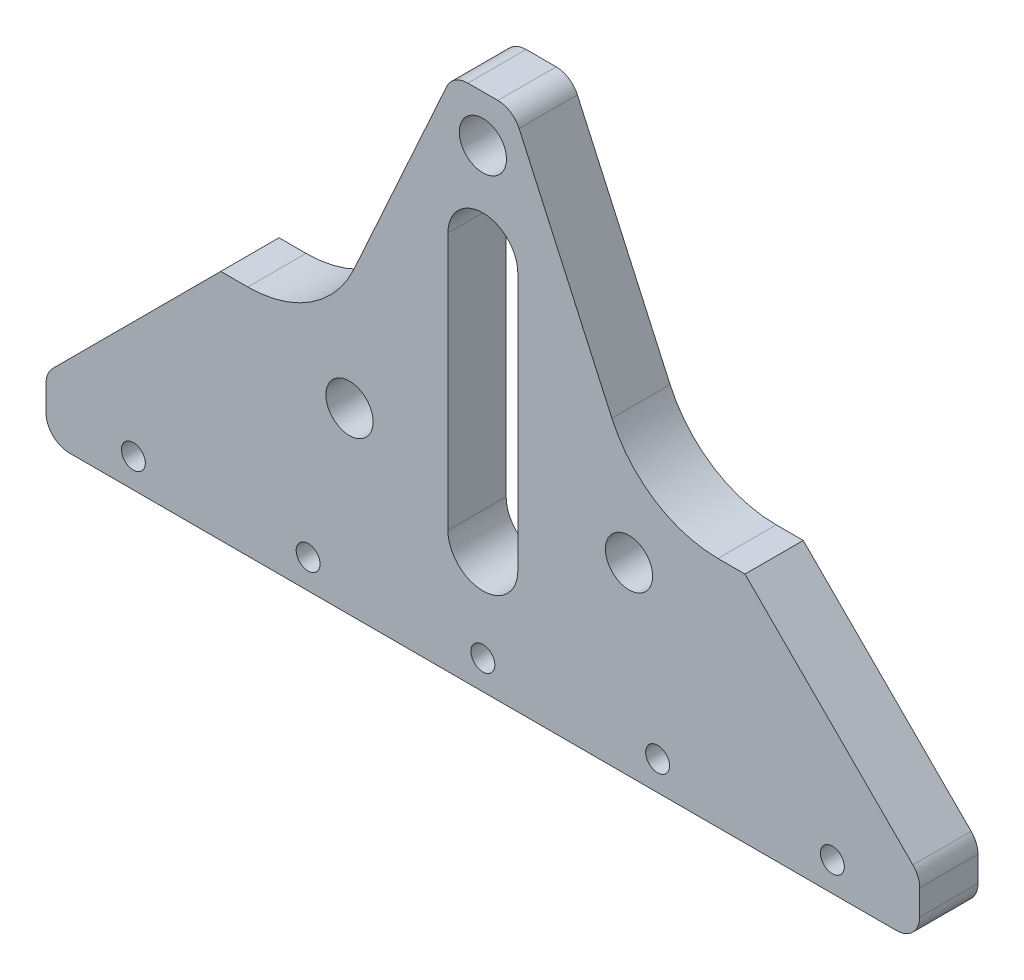
ISO-10303-21;
HEADER;
FILE_DESCRIPTION(('STEP AP214'),'2;1');
FILE_NAME('part.step','',(''),(''),'','','');
FILE_SCHEMA(('AUTOMOTIVE_DESIGN { 1 0 10303 214 1 1 1 1 }'));
ENDSEC;
DATA;
#1=APPLICATION_CONTEXT('core data for automotive mechanical design processes');
#2=APPLICATION_PROTOCOL_DEFINITION('international standard','automotive_design',2000,#1);
#3=PRODUCT_CONTEXT('',#1,'mechanical');
#4=PRODUCT('Part','Part','',(#3));
#5=PRODUCT_RELATED_PRODUCT_CATEGORY('part','',(#4));
#6=PRODUCT_DEFINITION_FORMATION('','',#4);
#7=PRODUCT_DEFINITION_CONTEXT('part definition',#1,'design');
#8=PRODUCT_DEFINITION('design','',#6,#7);
#9=PRODUCT_DEFINITION_SHAPE('','',#8);
#10=(LENGTH_UNIT() NAMED_UNIT(*) SI_UNIT(.MILLI.,.METRE.));
#11=(NAMED_UNIT(*) PLANE_ANGLE_UNIT() SI_UNIT($,.RADIAN.));
#12=(NAMED_UNIT(*) SI_UNIT($,.STERADIAN.) SOLID_ANGLE_UNIT());
#13=UNCERTAINTY_MEASURE_WITH_UNIT(LENGTH_MEASURE(1.E-05),#10,'distance_accuracy_value','');
#14=(GEOMETRIC_REPRESENTATION_CONTEXT(3) GLOBAL_UNCERTAINTY_ASSIGNED_CONTEXT((#13)) GLOBAL_UNIT_ASSIGNED_CONTEXT((#10,
#11,#12)) REPRESENTATION_CONTEXT('',''));
#15=CARTESIAN_POINT('',(0.,0.,0.));
#16=DIRECTION('',(0.,0.,1.));
#17=DIRECTION('',(1.,0.,0.));
#18=AXIS2_PLACEMENT_3D('',#15,#16,#17);
#19=CARTESIAN_POINT('',(37.5,-28.,5.));
#20=DIRECTION('',(-1.,0.,0.));
#21=DIRECTION('',(0.,0.,1.));
#22=AXIS2_PLACEMENT_3D('',#19,#20,#21);
#23=PLANE('',#22);
#24=DIRECTION('',(0.,1.,0.));
#25=VECTOR('',#24,1.);
#26=CARTESIAN_POINT('',(37.5,-28.,0.));
#27=LINE('',#26,#25);
#28=CARTESIAN_POINT('',(37.5,-26.,0.));
#29=VERTEX_POINT('',#28);
#30=CARTESIAN_POINT('',(37.5,-23.8284271247462,0.));
#31=VERTEX_POINT('',#30);
#32=EDGE_CURVE('E298',#29,#31,#27,.T.);
#33=ORIENTED_EDGE('',*,*,#32,.T.);
#34=DIRECTION('',(0.,0.,-1.));
#35=VECTOR('',#34,1.);
#36=CARTESIAN_POINT('',(37.5,-23.8284271247462,5.));
#37=LINE('',#36,#35);
#38=CARTESIAN_POINT('',(37.5,-23.8284271247462,5.));
#39=VERTEX_POINT('',#38);
#40=EDGE_CURVE('E372',#31,#39,#37,.F.);
#41=ORIENTED_EDGE('',*,*,#40,.T.);
#42=DIRECTION('',(0.,1.,0.));
#43=VECTOR('',#42,1.);
#44=CARTESIAN_POINT('',(37.5,-28.,5.));
#45=LINE('',#44,#43);
#46=CARTESIAN_POINT('',(37.5,-26.,5.));
#47=VERTEX_POINT('',#46);
#48=EDGE_CURVE('E313',#47,#39,#45,.T.);
#49=ORIENTED_EDGE('',*,*,#48,.F.);
#50=DIRECTION('',(0.,0.,-1.));
#51=VECTOR('',#50,1.);
#52=CARTESIAN_POINT('',(37.5,-26.,5.));
#53=LINE('',#52,#51);
#54=EDGE_CURVE('E369',#47,#29,#53,.T.);
#55=ORIENTED_EDGE('',*,*,#54,.T.);
#56=EDGE_LOOP('',(#33,#41,#49,#55));
#57=FACE_BOUND('',#56,.T.);
#58=ADVANCED_FACE('F35',(#57),#23,.F.);
#59=CARTESIAN_POINT('',(-37.5,-28.,5.));
#60=DIRECTION('',(1.,0.,0.));
#61=DIRECTION('',(0.,0.,-1.));
#62=AXIS2_PLACEMENT_3D('',#59,#60,#61);
#63=PLANE('',#62);
#64=DIRECTION('',(0.,-1.,0.));
#65=VECTOR('',#64,1.);
#66=CARTESIAN_POINT('',(-37.5,-28.,0.));
#67=LINE('',#66,#65);
#68=CARTESIAN_POINT('',(-37.5,-23.8284271247463,0.));
#69=VERTEX_POINT('',#68);
#70=CARTESIAN_POINT('',(-37.5,-26.,0.));
#71=VERTEX_POINT('',#70);
#72=EDGE_CURVE('E326',#69,#71,#67,.T.);
#73=ORIENTED_EDGE('',*,*,#72,.T.);
#74=DIRECTION('',(0.,0.,-1.));
#75=VECTOR('',#74,1.);
#76=CARTESIAN_POINT('',(-37.5,-26.,5.));
#77=LINE('',#76,#75);
#78=CARTESIAN_POINT('',(-37.5,-26.,5.));
#79=VERTEX_POINT('',#78);
#80=EDGE_CURVE('E390',#71,#79,#77,.F.);
#81=ORIENTED_EDGE('',*,*,#80,.T.);
#82=DIRECTION('',(0.,-1.,0.));
#83=VECTOR('',#82,1.);
#84=CARTESIAN_POINT('',(-37.5,-28.,5.));
#85=LINE('',#84,#83);
#86=CARTESIAN_POINT('',(-37.5,-23.8284271247463,5.));
#87=VERTEX_POINT('',#86);
#88=EDGE_CURVE('E316',#87,#79,#85,.T.);
#89=ORIENTED_EDGE('',*,*,#88,.F.);
#90=DIRECTION('',(0.,0.,-1.));
#91=VECTOR('',#90,1.);
#92=CARTESIAN_POINT('',(-37.5,-23.8284271247463,5.));
#93=LINE('',#92,#91);
#94=EDGE_CURVE('E387',#87,#69,#93,.T.);
#95=ORIENTED_EDGE('',*,*,#94,.T.);
#96=EDGE_LOOP('',(#73,#81,#89,#95));
#97=FACE_BOUND('',#96,.T.);
#98=ADVANCED_FACE('F456',(#97),#63,.F.);
#99=CARTESIAN_POINT('',(-37.5,-28.,5.));
#100=DIRECTION('',(0.,1.,0.));
#101=DIRECTION('',(0.,0.,1.));
#102=AXIS2_PLACEMENT_3D('',#99,#100,#101);
#103=PLANE('',#102);
#104=DIRECTION('',(1.,0.,0.));
#105=VECTOR('',#104,1.);
#106=CARTESIAN_POINT('',(-37.5,-28.,0.));
#107=LINE('',#106,#105);
#108=CARTESIAN_POINT('',(-35.5,-28.,0.));
#109=VERTEX_POINT('',#108);
#110=CARTESIAN_POINT('',(35.5,-28.,0.));
#111=VERTEX_POINT('',#110);
#112=EDGE_CURVE('E317',#109,#111,#107,.T.);
#113=ORIENTED_EDGE('',*,*,#112,.T.);
#114=DIRECTION('',(0.,0.,-1.));
#115=VECTOR('',#114,1.);
#116=CARTESIAN_POINT('',(35.5,-28.,5.));
#117=LINE('',#116,#115);
#118=CARTESIAN_POINT('',(35.5,-28.,5.));
#119=VERTEX_POINT('',#118);
#120=EDGE_CURVE('E385',#111,#119,#117,.F.);
#121=ORIENTED_EDGE('',*,*,#120,.T.);
#122=DIRECTION('',(1.,0.,0.));
#123=VECTOR('',#122,1.);
#124=CARTESIAN_POINT('',(-37.5,-28.,5.));
#125=LINE('',#124,#123);
#126=CARTESIAN_POINT('',(-35.5,-28.,5.));
#127=VERTEX_POINT('',#126);
#128=EDGE_CURVE('E320',#127,#119,#125,.T.);
#129=ORIENTED_EDGE('',*,*,#128,.F.);
#130=DIRECTION('',(0.,0.,-1.));
#131=VECTOR('',#130,1.);
#132=CARTESIAN_POINT('',(-35.5,-28.,5.));
#133=LINE('',#132,#131);
#134=EDGE_CURVE('E382',#127,#109,#133,.T.);
#135=ORIENTED_EDGE('',*,*,#134,.T.);
#136=EDGE_LOOP('',(#113,#121,#129,#135));
#137=FACE_BOUND('',#136,.T.);
#138=ADVANCED_FACE('F447',(#137),#103,.F.);
#139=CARTESIAN_POINT('',(0.,0.,5.));
#140=DIRECTION('',(0.,0.,-1.));
#141=DIRECTION('',(-1.,0.,0.));
#142=AXIS2_PLACEMENT_3D('',#139,#140,#141);
#143=PLANE('',#142);
#144=DIRECTION('',(0.,-1.,0.));
#145=VECTOR('',#144,1.);
#146=CARTESIAN_POINT('',(3.,0.,5.));
#147=LINE('',#146,#145);
#148=CARTESIAN_POINT('',(3.,4.60340392159669,5.));
#149=VERTEX_POINT('',#148);
#150=CARTESIAN_POINT('',(3.,-17.5000000000002,5.));
#151=VERTEX_POINT('',#150);
#152=EDGE_CURVE('E225',#149,#151,#147,.T.);
#153=ORIENTED_EDGE('',*,*,#152,.T.);
#154=CARTESIAN_POINT('',(0.,-17.5000000000002,5.));
#155=DIRECTION('',(0.,0.,-1.));
#156=DIRECTION('',(-1.,0.,0.));
#157=AXIS2_PLACEMENT_3D('',#154,#155,#156);
#158=CIRCLE('',#157,3.);
#159=CARTESIAN_POINT('',(-3.,-17.5000000000002,5.));
#160=VERTEX_POINT('',#159);
#161=EDGE_CURVE('E228',#151,#160,#158,.T.);
#162=ORIENTED_EDGE('',*,*,#161,.T.);
#163=DIRECTION('',(0.,1.,0.));
#164=VECTOR('',#163,1.);
#165=CARTESIAN_POINT('',(-3.,0.,5.));
#166=LINE('',#165,#164);
#167=CARTESIAN_POINT('',(-3.,4.60340392159669,5.));
#168=VERTEX_POINT('',#167);
#169=EDGE_CURVE('E220',#160,#168,#166,.T.);
#170=ORIENTED_EDGE('',*,*,#169,.T.);
#171=CARTESIAN_POINT('',(0.,4.60340392159669,5.));
#172=DIRECTION('',(0.,0.,-1.));
#173=DIRECTION('',(-1.,0.,0.));
#174=AXIS2_PLACEMENT_3D('',#171,#172,#173);
#175=CIRCLE('',#174,3.);
#176=EDGE_CURVE('E195',#168,#149,#175,.T.);
#177=ORIENTED_EDGE('',*,*,#176,.T.);
#178=EDGE_LOOP('',(#153,#162,#170,#177));
#179=FACE_BOUND('',#178,.T.);
#180=CARTESIAN_POINT('',(-30.,-25.5,5.));
#181=DIRECTION('',(0.,0.,-1.));
#182=DIRECTION('',(-1.,0.,0.));
#183=AXIS2_PLACEMENT_3D('',#180,#181,#182);
#184=CIRCLE('',#183,1.02499999999989);
#185=CARTESIAN_POINT('',(-31.0249999999999,-25.5,5.));
#186=VERTEX_POINT('',#185);
#187=EDGE_CURVE('E268',#186,#186,#184,.T.);
#188=ORIENTED_EDGE('',*,*,#187,.T.);
#189=EDGE_LOOP('',(#188));
#190=FACE_BOUND('',#189,.T.);
#191=CARTESIAN_POINT('',(-15.,-25.5000000000001,5.));
#192=DIRECTION('',(0.,0.,-1.));
#193=DIRECTION('',(-1.,0.,0.));
#194=AXIS2_PLACEMENT_3D('',#191,#192,#193);
#195=CIRCLE('',#194,1.025);
#196=CARTESIAN_POINT('',(-16.025,-25.5000000000001,5.));
#197=VERTEX_POINT('',#196);
#198=EDGE_CURVE('E265',#197,#197,#195,.T.);
#199=ORIENTED_EDGE('',*,*,#198,.T.);
#200=EDGE_LOOP('',(#199));
#201=FACE_BOUND('',#200,.T.);
#202=CARTESIAN_POINT('',(0.,-25.5000000000002,5.));
#203=DIRECTION('',(0.,0.,-1.));
#204=DIRECTION('',(-1.,0.,0.));
#205=AXIS2_PLACEMENT_3D('',#202,#203,#204);
#206=CIRCLE('',#205,1.025);
#207=CARTESIAN_POINT('',(-1.02500000000001,-25.5000000000002,5.));
#208=VERTEX_POINT('',#207);
#209=EDGE_CURVE('E262',#208,#208,#206,.T.);
#210=ORIENTED_EDGE('',*,*,#209,.T.);
#211=EDGE_LOOP('',(#210));
#212=FACE_BOUND('',#211,.T.);
#213=CARTESIAN_POINT('',(15.,-25.5000000000003,5.));
#214=DIRECTION('',(0.,0.,-1.));
#215=DIRECTION('',(-1.,0.,0.));
#216=AXIS2_PLACEMENT_3D('',#213,#214,#215);
#217=CIRCLE('',#216,1.025);
#218=CARTESIAN_POINT('',(13.975,-25.5000000000003,5.));
#219=VERTEX_POINT('',#218);
#220=EDGE_CURVE('E259',#219,#219,#217,.T.);
#221=ORIENTED_EDGE('',*,*,#220,.T.);
#222=EDGE_LOOP('',(#221));
#223=FACE_BOUND('',#222,.T.);
#224=CARTESIAN_POINT('',(30.,-25.5000000000004,5.));
#225=DIRECTION('',(0.,0.,-1.));
#226=DIRECTION('',(-1.,0.,0.));
#227=AXIS2_PLACEMENT_3D('',#224,#225,#226);
#228=CIRCLE('',#227,1.025);
#229=CARTESIAN_POINT('',(28.975,-25.5000000000004,5.));
#230=VERTEX_POINT('',#229);
#231=EDGE_CURVE('E245',#230,#230,#228,.T.);
#232=ORIENTED_EDGE('',*,*,#231,.T.);
#233=EDGE_LOOP('',(#232));
#234=FACE_BOUND('',#233,.T.);
#235=DIRECTION('',(-0.412885459009978,0.910782958634009,0.));
#236=VECTOR('',#235,1.);
#237=CARTESIAN_POINT('',(2.57850472683667,16.6034039215967,5.));
#238=LINE('',#237,#236);
#239=CARTESIAN_POINT('',(11.0704040103885,-2.12885459009978,5.));
#240=VERTEX_POINT('',#239);
#241=CARTESIAN_POINT('',(3.11081828068635,15.4291748396166,5.));
#242=VERTEX_POINT('',#241);
#243=EDGE_CURVE('E282',#240,#242,#238,.T.);
#244=ORIENTED_EDGE('',*,*,#243,.T.);
#245=CARTESIAN_POINT('',(1.28925236341834,14.6034039215967,5.));
#246=DIRECTION('',(0.,0.,-1.));
#247=DIRECTION('',(-1.,0.,0.));
#248=AXIS2_PLACEMENT_3D('',#245,#246,#247);
#249=CIRCLE('',#248,2.);
#250=CARTESIAN_POINT('',(1.28925236341834,16.6034039215967,5.));
#251=VERTEX_POINT('',#250);
#252=EDGE_CURVE('E43',#242,#251,#249,.F.);
#253=ORIENTED_EDGE('',*,*,#252,.T.);
#254=DIRECTION('',(-1.,0.,0.));
#255=VECTOR('',#254,1.);
#256=CARTESIAN_POINT('',(0.,16.6034039215967,5.));
#257=LINE('',#256,#255);
#258=CARTESIAN_POINT('',(-1.28925236341834,16.6034039215967,5.));
#259=VERTEX_POINT('',#258);
#260=EDGE_CURVE('E272',#251,#259,#257,.T.);
#261=ORIENTED_EDGE('',*,*,#260,.T.);
#262=CARTESIAN_POINT('',(-1.28925236341834,14.6034039215967,5.));
#263=DIRECTION('',(0.,0.,-1.));
#264=DIRECTION('',(-1.,0.,0.));
#265=AXIS2_PLACEMENT_3D('',#262,#263,#264);
#266=CIRCLE('',#265,2.);
#267=CARTESIAN_POINT('',(-3.11081828068636,15.4291748396166,5.));
#268=VERTEX_POINT('',#267);
#269=EDGE_CURVE('E50',#259,#268,#266,.F.);
#270=ORIENTED_EDGE('',*,*,#269,.T.);
#271=DIRECTION('',(-0.412885459009978,-0.910782958634009,0.));
#272=VECTOR('',#271,1.);
#273=CARTESIAN_POINT('',(-2.57850472683668,16.6034039215967,5.));
#274=LINE('',#273,#272);
#275=CARTESIAN_POINT('',(-11.0704040103885,-2.12885459009979,5.));
#276=VERTEX_POINT('',#275);
#277=EDGE_CURVE('E274',#268,#276,#274,.T.);
#278=ORIENTED_EDGE('',*,*,#277,.T.);
#279=CARTESIAN_POINT('',(-20.1782335967286,1.99999999999999,5.));
#280=DIRECTION('',(0.,0.,-1.));
#281=DIRECTION('',(-1.,0.,0.));
#282=AXIS2_PLACEMENT_3D('',#279,#280,#281);
#283=CIRCLE('',#282,10.);
#284=CARTESIAN_POINT('',(-20.1782335967286,-8.00000000000001,5.));
#285=VERTEX_POINT('',#284);
#286=EDGE_CURVE('E345',#276,#285,#283,.T.);
#287=ORIENTED_EDGE('',*,*,#286,.T.);
#288=DIRECTION('',(-1.,0.,0.));
#289=VECTOR('',#288,1.);
#290=CARTESIAN_POINT('',(-13.7319717796369,-7.99999999999999,5.));
#291=LINE('',#290,#289);
#292=CARTESIAN_POINT('',(-22.4999999999999,-8.00000000000002,5.));
#293=VERTEX_POINT('',#292);
#294=EDGE_CURVE('E277',#285,#293,#291,.T.);
#295=ORIENTED_EDGE('',*,*,#294,.T.);
#296=DIRECTION('',(-0.707106781186549,-0.707106781186546,0.));
#297=VECTOR('',#296,1.);
#298=CARTESIAN_POINT('',(-7.2499999999999,7.24999999999993,5.));
#299=LINE('',#298,#297);
#300=CARTESIAN_POINT('',(-36.9142135623731,-22.4142135623731,5.));
#301=VERTEX_POINT('',#300);
#302=EDGE_CURVE('E234',#293,#301,#299,.T.);
#303=ORIENTED_EDGE('',*,*,#302,.T.);
#304=CARTESIAN_POINT('',(-35.5,-23.8284271247463,5.));
#305=DIRECTION('',(0.,0.,-1.));
#306=DIRECTION('',(-1.,0.,0.));
#307=AXIS2_PLACEMENT_3D('',#304,#305,#306);
#308=CIRCLE('',#307,2.);
#309=EDGE_CURVE('E374',#301,#87,#308,.F.);
#310=ORIENTED_EDGE('',*,*,#309,.T.);
#311=ORIENTED_EDGE('',*,*,#88,.T.);
#312=CARTESIAN_POINT('',(-35.5,-26.,5.));
#313=DIRECTION('',(0.,0.,-1.));
#314=DIRECTION('',(-1.,0.,0.));
#315=AXIS2_PLACEMENT_3D('',#312,#313,#314);
#316=CIRCLE('',#315,2.);
#317=EDGE_CURVE('E376',#79,#127,#316,.F.);
#318=ORIENTED_EDGE('',*,*,#317,.T.);
#319=ORIENTED_EDGE('',*,*,#128,.T.);
#320=CARTESIAN_POINT('',(35.5,-26.,5.));
#321=DIRECTION('',(0.,0.,-1.));
#322=DIRECTION('',(-1.,0.,0.));
#323=AXIS2_PLACEMENT_3D('',#320,#321,#322);
#324=CIRCLE('',#323,2.);
#325=EDGE_CURVE('E378',#119,#47,#324,.F.);
#326=ORIENTED_EDGE('',*,*,#325,.T.);
#327=ORIENTED_EDGE('',*,*,#48,.T.);
#328=CARTESIAN_POINT('',(35.5,-23.8284271247462,5.));
#329=DIRECTION('',(0.,0.,-1.));
#330=DIRECTION('',(-1.,0.,0.));
#331=AXIS2_PLACEMENT_3D('',#328,#329,#330);
#332=CIRCLE('',#331,2.);
#333=CARTESIAN_POINT('',(36.9142135623731,-22.4142135623731,5.));
#334=VERTEX_POINT('',#333);
#335=EDGE_CURVE('E380',#39,#334,#332,.F.);
#336=ORIENTED_EDGE('',*,*,#335,.T.);
#337=DIRECTION('',(-0.707106781186549,0.707106781186546,0.));
#338=VECTOR('',#337,1.);
#339=CARTESIAN_POINT('',(7.24999999999994,7.24999999999996,5.));
#340=LINE('',#339,#338);
#341=CARTESIAN_POINT('',(22.4999999999999,-8.,5.));
#342=VERTEX_POINT('',#341);
#343=EDGE_CURVE('E239',#334,#342,#340,.T.);
#344=ORIENTED_EDGE('',*,*,#343,.T.);
#345=DIRECTION('',(-1.,0.,0.));
#346=VECTOR('',#345,1.);
#347=CARTESIAN_POINT('',(13.7319717796369,-8.,5.));
#348=LINE('',#347,#346);
#349=CARTESIAN_POINT('',(20.1782335967286,-8.,5.));
#350=VERTEX_POINT('',#349);
#351=EDGE_CURVE('E280',#342,#350,#348,.T.);
#352=ORIENTED_EDGE('',*,*,#351,.T.);
#353=CARTESIAN_POINT('',(20.1782335967286,2.,5.));
#354=DIRECTION('',(0.,0.,-1.));
#355=DIRECTION('',(-1.,0.,0.));
#356=AXIS2_PLACEMENT_3D('',#353,#354,#355);
#357=CIRCLE('',#356,10.);
#358=EDGE_CURVE('E350',#350,#240,#357,.T.);
#359=ORIENTED_EDGE('',*,*,#358,.T.);
#360=EDGE_LOOP('',(#244,#253,#261,#270,#278,#287,#295,#303,#310,#311,#318,#319,#326,#327,#336,
#344,#352,#359));
#361=FACE_BOUND('',#360,.T.);
#362=CARTESIAN_POINT('',(-11.4496644203831,-12.6533810016792,5.));
#363=DIRECTION('',(0.,0.,-1.));
#364=DIRECTION('',(-1.,0.,0.));
#365=AXIS2_PLACEMENT_3D('',#362,#363,#364);
#366=CIRCLE('',#365,2.025);
#367=CARTESIAN_POINT('',(-13.4746644203831,-12.6533810016792,5.));
#368=VERTEX_POINT('',#367);
#369=EDGE_CURVE('E295',#368,#368,#366,.T.);
#370=ORIENTED_EDGE('',*,*,#369,.T.);
#371=EDGE_LOOP('',(#370));
#372=FACE_BOUND('',#371,.T.);
#373=CARTESIAN_POINT('',(0.,12.6034039215967,5.));
#374=DIRECTION('',(0.,0.,-1.));
#375=DIRECTION('',(-1.,0.,0.));
#376=AXIS2_PLACEMENT_3D('',#373,#374,#375);
#377=CIRCLE('',#376,2.025);
#378=CARTESIAN_POINT('',(-2.025,12.6034039215967,5.));
#379=VERTEX_POINT('',#378);
#380=EDGE_CURVE('E302',#379,#379,#377,.T.);
#381=ORIENTED_EDGE('',*,*,#380,.T.);
#382=EDGE_LOOP('',(#381));
#383=FACE_BOUND('',#382,.T.);
#384=CARTESIAN_POINT('',(12.5445804522253,-12.1278213063949,5.));
#385=DIRECTION('',(0.,0.,-1.));
#386=DIRECTION('',(-1.,0.,0.));
#387=AXIS2_PLACEMENT_3D('',#384,#385,#386);
#388=CIRCLE('',#387,2.025);
#389=CARTESIAN_POINT('',(10.5195804522253,-12.1278213063949,5.));
#390=VERTEX_POINT('',#389);
#391=EDGE_CURVE('E308',#390,#390,#388,.T.);
#392=ORIENTED_EDGE('',*,*,#391,.T.);
#393=EDGE_LOOP('',(#392));
#394=FACE_BOUND('',#393,.T.);
#395=ADVANCED_FACE('F406',(#179,#190,#201,#212,#223,#234,#361,#372,#383,#394),#143,.F.);
#396=CARTESIAN_POINT('',(0.,0.,0.));
#397=DIRECTION('',(0.,0.,-1.));
#398=DIRECTION('',(-1.,0.,0.));
#399=AXIS2_PLACEMENT_3D('',#396,#397,#398);
#400=PLANE('',#399);
#401=CARTESIAN_POINT('',(0.,-17.5000000000002,0.));
#402=DIRECTION('',(0.,0.,-1.));
#403=DIRECTION('',(-1.,0.,0.));
#404=AXIS2_PLACEMENT_3D('',#401,#402,#403);
#405=CIRCLE('',#404,3.);
#406=CARTESIAN_POINT('',(3.,-17.5000000000002,0.));
#407=VERTEX_POINT('',#406);
#408=CARTESIAN_POINT('',(-3.,-17.5000000000002,0.));
#409=VERTEX_POINT('',#408);
#410=EDGE_CURVE('E208',#407,#409,#405,.T.);
#411=ORIENTED_EDGE('',*,*,#410,.F.);
#412=DIRECTION('',(0.,-1.,0.));
#413=VECTOR('',#412,1.);
#414=CARTESIAN_POINT('',(3.,-17.5000000000002,0.));
#415=LINE('',#414,#413);
#416=CARTESIAN_POINT('',(3.,4.60340392159669,0.));
#417=VERTEX_POINT('',#416);
#418=EDGE_CURVE('E213',#417,#407,#415,.T.);
#419=ORIENTED_EDGE('',*,*,#418,.F.);
#420=CARTESIAN_POINT('',(0.,4.60340392159669,0.));
#421=DIRECTION('',(0.,0.,-1.));
#422=DIRECTION('',(-1.,0.,0.));
#423=AXIS2_PLACEMENT_3D('',#420,#421,#422);
#424=CIRCLE('',#423,3.);
#425=CARTESIAN_POINT('',(-3.,4.60340392159669,0.));
#426=VERTEX_POINT('',#425);
#427=EDGE_CURVE('E192',#426,#417,#424,.T.);
#428=ORIENTED_EDGE('',*,*,#427,.F.);
#429=DIRECTION('',(0.,1.,0.));
#430=VECTOR('',#429,1.);
#431=CARTESIAN_POINT('',(-3.,-17.5000000000002,0.));
#432=LINE('',#431,#430);
#433=EDGE_CURVE('E203',#409,#426,#432,.T.);
#434=ORIENTED_EDGE('',*,*,#433,.F.);
#435=EDGE_LOOP('',(#411,#419,#428,#434));
#436=FACE_BOUND('',#435,.T.);
#437=DIRECTION('',(-1.,0.,0.));
#438=VECTOR('',#437,1.);
#439=CARTESIAN_POINT('',(0.,16.6034039215967,0.));
#440=LINE('',#439,#438);
#441=CARTESIAN_POINT('',(1.28925236341834,16.6034039215967,0.));
#442=VERTEX_POINT('',#441);
#443=CARTESIAN_POINT('',(-1.28925236341834,16.6034039215967,0.));
#444=VERTEX_POINT('',#443);
#445=EDGE_CURVE('E275',#442,#444,#440,.T.);
#446=ORIENTED_EDGE('',*,*,#445,.F.);
#447=CARTESIAN_POINT('',(1.28925236341834,14.6034039215967,0.));
#448=DIRECTION('',(0.,0.,-1.));
#449=DIRECTION('',(-1.,0.,0.));
#450=AXIS2_PLACEMENT_3D('',#447,#448,#449);
#451=CIRCLE('',#450,2.);
#452=CARTESIAN_POINT('',(3.11081828068635,15.4291748396166,0.));
#453=VERTEX_POINT('',#452);
#454=EDGE_CURVE('E401',#442,#453,#451,.T.);
#455=ORIENTED_EDGE('',*,*,#454,.T.);
#456=DIRECTION('',(-0.412885459009978,0.910782958634009,0.));
#457=VECTOR('',#456,1.);
#458=CARTESIAN_POINT('',(2.57850472683667,16.6034039215967,0.));
#459=LINE('',#458,#457);
#460=CARTESIAN_POINT('',(11.0704040103885,-2.12885459009978,0.));
#461=VERTEX_POINT('',#460);
#462=EDGE_CURVE('E291',#461,#453,#459,.T.);
#463=ORIENTED_EDGE('',*,*,#462,.F.);
#464=CARTESIAN_POINT('',(20.1782335967286,2.,0.));
#465=DIRECTION('',(0.,0.,-1.));
#466=DIRECTION('',(-1.,0.,0.));
#467=AXIS2_PLACEMENT_3D('',#464,#465,#466);
#468=CIRCLE('',#467,10.);
#469=CARTESIAN_POINT('',(20.1782335967286,-8.,0.));
#470=VERTEX_POINT('',#469);
#471=EDGE_CURVE('E347',#461,#470,#468,.F.);
#472=ORIENTED_EDGE('',*,*,#471,.T.);
#473=DIRECTION('',(-1.,0.,0.));
#474=VECTOR('',#473,1.);
#475=CARTESIAN_POINT('',(13.7319717796369,-8.,0.));
#476=LINE('',#475,#474);
#477=CARTESIAN_POINT('',(22.4999999999999,-8.,0.));
#478=VERTEX_POINT('',#477);
#479=EDGE_CURVE('E289',#478,#470,#476,.T.);
#480=ORIENTED_EDGE('',*,*,#479,.F.);
#481=DIRECTION('',(-0.707106781186549,0.707106781186546,0.));
#482=VECTOR('',#481,1.);
#483=CARTESIAN_POINT('',(37.5,-23.,0.));
#484=LINE('',#483,#482);
#485=CARTESIAN_POINT('',(36.9142135623731,-22.4142135623731,0.));
#486=VERTEX_POINT('',#485);
#487=EDGE_CURVE('E232',#486,#478,#484,.T.);
#488=ORIENTED_EDGE('',*,*,#487,.F.);
#489=CARTESIAN_POINT('',(35.5,-23.8284271247462,0.));
#490=DIRECTION('',(0.,0.,-1.));
#491=DIRECTION('',(-1.,0.,0.));
#492=AXIS2_PLACEMENT_3D('',#489,#490,#491);
#493=CIRCLE('',#492,2.);
#494=EDGE_CURVE('E367',#486,#31,#493,.T.);
#495=ORIENTED_EDGE('',*,*,#494,.T.);
#496=ORIENTED_EDGE('',*,*,#32,.F.);
#497=CARTESIAN_POINT('',(35.5,-26.,0.));
#498=DIRECTION('',(0.,0.,-1.));
#499=DIRECTION('',(-1.,0.,0.));
#500=AXIS2_PLACEMENT_3D('',#497,#498,#499);
#501=CIRCLE('',#500,2.);
#502=EDGE_CURVE('E365',#29,#111,#501,.T.);
#503=ORIENTED_EDGE('',*,*,#502,.T.);
#504=ORIENTED_EDGE('',*,*,#112,.F.);
#505=CARTESIAN_POINT('',(-35.5,-26.,0.));
#506=DIRECTION('',(0.,0.,-1.));
#507=DIRECTION('',(-1.,0.,0.));
#508=AXIS2_PLACEMENT_3D('',#505,#506,#507);
#509=CIRCLE('',#508,2.);
#510=EDGE_CURVE('E363',#109,#71,#509,.T.);
#511=ORIENTED_EDGE('',*,*,#510,.T.);
#512=ORIENTED_EDGE('',*,*,#72,.F.);
#513=CARTESIAN_POINT('',(-35.5,-23.8284271247463,0.));
#514=DIRECTION('',(0.,0.,-1.));
#515=DIRECTION('',(-1.,0.,0.));
#516=AXIS2_PLACEMENT_3D('',#513,#514,#515);
#517=CIRCLE('',#516,2.);
#518=CARTESIAN_POINT('',(-36.9142135623731,-22.4142135623732,0.));
#519=VERTEX_POINT('',#518);
#520=EDGE_CURVE('E361',#69,#519,#517,.T.);
#521=ORIENTED_EDGE('',*,*,#520,.T.);
#522=DIRECTION('',(-0.707106781186549,-0.707106781186546,0.));
#523=VECTOR('',#522,1.);
#524=CARTESIAN_POINT('',(-22.4999999999999,-8.00000000000001,0.));
#525=LINE('',#524,#523);
#526=CARTESIAN_POINT('',(-22.4999999999999,-8.00000000000001,0.));
#527=VERTEX_POINT('',#526);
#528=EDGE_CURVE('E231',#527,#519,#525,.T.);
#529=ORIENTED_EDGE('',*,*,#528,.F.);
#530=DIRECTION('',(-1.,0.,0.));
#531=VECTOR('',#530,1.);
#532=CARTESIAN_POINT('',(-13.7319717796369,-7.99999999999999,0.));
#533=LINE('',#532,#531);
#534=CARTESIAN_POINT('',(-20.1782335967286,-8.00000000000001,0.));
#535=VERTEX_POINT('',#534);
#536=EDGE_CURVE('E286',#535,#527,#533,.T.);
#537=ORIENTED_EDGE('',*,*,#536,.F.);
#538=CARTESIAN_POINT('',(-20.1782335967286,1.99999999999999,0.));
#539=DIRECTION('',(0.,0.,-1.));
#540=DIRECTION('',(-1.,0.,0.));
#541=AXIS2_PLACEMENT_3D('',#538,#539,#540);
#542=CIRCLE('',#541,10.);
#543=CARTESIAN_POINT('',(-11.0704040103885,-2.12885459009979,0.));
#544=VERTEX_POINT('',#543);
#545=EDGE_CURVE('E342',#535,#544,#542,.F.);
#546=ORIENTED_EDGE('',*,*,#545,.T.);
#547=DIRECTION('',(-0.412885459009978,-0.910782958634009,0.));
#548=VECTOR('',#547,1.);
#549=CARTESIAN_POINT('',(-2.57850472683668,16.6034039215967,0.));
#550=LINE('',#549,#548);
#551=CARTESIAN_POINT('',(-3.11081828068636,15.4291748396166,0.));
#552=VERTEX_POINT('',#551);
#553=EDGE_CURVE('E271',#552,#544,#550,.T.);
#554=ORIENTED_EDGE('',*,*,#553,.F.);
#555=CARTESIAN_POINT('',(-1.28925236341834,14.6034039215967,0.));
#556=DIRECTION('',(0.,0.,-1.));
#557=DIRECTION('',(-1.,0.,0.));
#558=AXIS2_PLACEMENT_3D('',#555,#556,#557);
#559=CIRCLE('',#558,2.);
#560=EDGE_CURVE('E399',#552,#444,#559,.T.);
#561=ORIENTED_EDGE('',*,*,#560,.T.);
#562=EDGE_LOOP('',(#446,#455,#463,#472,#480,#488,#495,#496,#503,#504,#511,#512,#521,#529,#537,
#546,#554,#561));
#563=FACE_BOUND('',#562,.T.);
#564=CARTESIAN_POINT('',(-30.,-25.5,0.));
#565=DIRECTION('',(0.,0.,-1.));
#566=DIRECTION('',(-1.,0.,0.));
#567=AXIS2_PLACEMENT_3D('',#564,#565,#566);
#568=CIRCLE('',#567,1.02499999999989);
#569=CARTESIAN_POINT('',(-31.0249999999999,-25.5,0.));
#570=VERTEX_POINT('',#569);
#571=EDGE_CURVE('E242',#570,#570,#568,.T.);
#572=ORIENTED_EDGE('',*,*,#571,.F.);
#573=EDGE_LOOP('',(#572));
#574=FACE_BOUND('',#573,.T.);
#575=CARTESIAN_POINT('',(-15.,-25.5000000000001,0.));
#576=DIRECTION('',(0.,0.,-1.));
#577=DIRECTION('',(-1.,0.,0.));
#578=AXIS2_PLACEMENT_3D('',#575,#576,#577);
#579=CIRCLE('',#578,1.025);
#580=CARTESIAN_POINT('',(-16.025,-25.5000000000001,0.));
#581=VERTEX_POINT('',#580);
#582=EDGE_CURVE('E246',#581,#581,#579,.T.);
#583=ORIENTED_EDGE('',*,*,#582,.F.);
#584=EDGE_LOOP('',(#583));
#585=FACE_BOUND('',#584,.T.);
#586=CARTESIAN_POINT('',(0.,-25.5000000000002,0.));
#587=DIRECTION('',(0.,0.,-1.));
#588=DIRECTION('',(-1.,0.,0.));
#589=AXIS2_PLACEMENT_3D('',#586,#587,#588);
#590=CIRCLE('',#589,1.025);
#591=CARTESIAN_POINT('',(-1.02500000000001,-25.5000000000002,0.));
#592=VERTEX_POINT('',#591);
#593=EDGE_CURVE('E249',#592,#592,#590,.T.);
#594=ORIENTED_EDGE('',*,*,#593,.F.);
#595=EDGE_LOOP('',(#594));
#596=FACE_BOUND('',#595,.T.);
#597=CARTESIAN_POINT('',(15.,-25.5000000000003,0.));
#598=DIRECTION('',(0.,0.,-1.));
#599=DIRECTION('',(-1.,0.,0.));
#600=AXIS2_PLACEMENT_3D('',#597,#598,#599);
#601=CIRCLE('',#600,1.025);
#602=CARTESIAN_POINT('',(13.975,-25.5000000000003,0.));
#603=VERTEX_POINT('',#602);
#604=EDGE_CURVE('E252',#603,#603,#601,.T.);
#605=ORIENTED_EDGE('',*,*,#604,.F.);
#606=EDGE_LOOP('',(#605));
#607=FACE_BOUND('',#606,.T.);
#608=CARTESIAN_POINT('',(30.,-25.5000000000004,0.));
#609=DIRECTION('',(0.,0.,-1.));
#610=DIRECTION('',(-1.,0.,0.));
#611=AXIS2_PLACEMENT_3D('',#608,#609,#610);
#612=CIRCLE('',#611,1.025);
#613=CARTESIAN_POINT('',(28.975,-25.5000000000004,0.));
#614=VERTEX_POINT('',#613);
#615=EDGE_CURVE('E241',#614,#614,#612,.T.);
#616=ORIENTED_EDGE('',*,*,#615,.F.);
#617=EDGE_LOOP('',(#616));
#618=FACE_BOUND('',#617,.T.);
#619=CARTESIAN_POINT('',(-11.4496644203831,-12.6533810016792,0.));
#620=DIRECTION('',(0.,0.,-1.));
#621=DIRECTION('',(-1.,0.,0.));
#622=AXIS2_PLACEMENT_3D('',#619,#620,#621);
#623=CIRCLE('',#622,2.025);
#624=CARTESIAN_POINT('',(-13.4746644203831,-12.6533810016792,0.));
#625=VERTEX_POINT('',#624);
#626=EDGE_CURVE('E299',#625,#625,#623,.T.);
#627=ORIENTED_EDGE('',*,*,#626,.F.);
#628=EDGE_LOOP('',(#627));
#629=FACE_BOUND('',#628,.T.);
#630=CARTESIAN_POINT('',(0.,12.6034039215967,0.));
#631=DIRECTION('',(0.,0.,-1.));
#632=DIRECTION('',(-1.,0.,0.));
#633=AXIS2_PLACEMENT_3D('',#630,#631,#632);
#634=CIRCLE('',#633,2.025);
#635=CARTESIAN_POINT('',(-2.025,12.6034039215967,0.));
#636=VERTEX_POINT('',#635);
#637=EDGE_CURVE('E305',#636,#636,#634,.T.);
#638=ORIENTED_EDGE('',*,*,#637,.F.);
#639=EDGE_LOOP('',(#638));
#640=FACE_BOUND('',#639,.T.);
#641=CARTESIAN_POINT('',(12.5445804522253,-12.1278213063949,0.));
#642=DIRECTION('',(0.,0.,-1.));
#643=DIRECTION('',(-1.,0.,0.));
#644=AXIS2_PLACEMENT_3D('',#641,#642,#643);
#645=CIRCLE('',#644,2.025);
#646=CARTESIAN_POINT('',(10.5195804522253,-12.1278213063949,0.));
#647=VERTEX_POINT('',#646);
#648=EDGE_CURVE('E284',#647,#647,#645,.T.);
#649=ORIENTED_EDGE('',*,*,#648,.F.);
#650=EDGE_LOOP('',(#649));
#651=FACE_BOUND('',#650,.T.);
#652=ADVANCED_FACE('F210',(#436,#563,#574,#585,#596,#607,#618,#629,#640,#651),#400,.T.);
#653=CARTESIAN_POINT('',(12.5445804522253,-12.1278213063949,5.));
#654=DIRECTION('',(0.,0.,-1.));
#655=DIRECTION('',(-1.,0.,0.));
#656=AXIS2_PLACEMENT_3D('',#653,#654,#655);
#657=CYLINDRICAL_SURFACE('',#656,2.025);
#658=ORIENTED_EDGE('',*,*,#391,.F.);
#659=EDGE_LOOP('',(#658));
#660=FACE_BOUND('',#659,.T.);
#661=ORIENTED_EDGE('',*,*,#648,.T.);
#662=EDGE_LOOP('',(#661));
#663=FACE_BOUND('',#662,.T.);
#664=ADVANCED_FACE('F557',(#660,#663),#657,.F.);
#665=CARTESIAN_POINT('',(0.,12.6034039215967,5.));
#666=DIRECTION('',(0.,0.,-1.));
#667=DIRECTION('',(-1.,0.,0.));
#668=AXIS2_PLACEMENT_3D('',#665,#666,#667);
#669=CYLINDRICAL_SURFACE('',#668,2.025);
#670=ORIENTED_EDGE('',*,*,#380,.F.);
#671=EDGE_LOOP('',(#670));
#672=FACE_BOUND('',#671,.T.);
#673=ORIENTED_EDGE('',*,*,#637,.T.);
#674=EDGE_LOOP('',(#673));
#675=FACE_BOUND('',#674,.T.);
#676=ADVANCED_FACE('F726',(#672,#675),#669,.F.);
#677=CARTESIAN_POINT('',(-11.4496644203831,-12.6533810016792,5.));
#678=DIRECTION('',(0.,0.,-1.));
#679=DIRECTION('',(-1.,0.,0.));
#680=AXIS2_PLACEMENT_3D('',#677,#678,#679);
#681=CYLINDRICAL_SURFACE('',#680,2.025);
#682=ORIENTED_EDGE('',*,*,#369,.F.);
#683=EDGE_LOOP('',(#682));
#684=FACE_BOUND('',#683,.T.);
#685=ORIENTED_EDGE('',*,*,#626,.T.);
#686=EDGE_LOOP('',(#685));
#687=FACE_BOUND('',#686,.T.);
#688=ADVANCED_FACE('F548',(#684,#687),#681,.F.);
#689=CARTESIAN_POINT('',(0.,16.6034039215967,5.));
#690=DIRECTION('',(0.,-1.,0.));
#691=DIRECTION('',(0.,0.,-1.));
#692=AXIS2_PLACEMENT_3D('',#689,#690,#691);
#693=PLANE('',#692);
#694=ORIENTED_EDGE('',*,*,#260,.F.);
#695=DIRECTION('',(0.,0.,-1.));
#696=VECTOR('',#695,1.);
#697=CARTESIAN_POINT('',(1.28925236341834,16.6034039215967,5.));
#698=LINE('',#697,#696);
#699=EDGE_CURVE('E396',#251,#442,#698,.T.);
#700=ORIENTED_EDGE('',*,*,#699,.T.);
#701=ORIENTED_EDGE('',*,*,#445,.T.);
#702=DIRECTION('',(0.,0.,-1.));
#703=VECTOR('',#702,1.);
#704=CARTESIAN_POINT('',(-1.28925236341834,16.6034039215967,5.));
#705=LINE('',#704,#703);
#706=EDGE_CURVE('E394',#444,#259,#705,.F.);
#707=ORIENTED_EDGE('',*,*,#706,.T.);
#708=EDGE_LOOP('',(#694,#700,#701,#707));
#709=FACE_BOUND('',#708,.T.);
#710=ADVANCED_FACE('F411',(#709),#693,.F.);
#711=CARTESIAN_POINT('',(2.57850472683667,16.6034039215967,5.));
#712=DIRECTION('',(-0.91078295863401,-0.412885459009978,0.));
#713=DIRECTION('',(0.412885459009978,-0.91078295863401,0.));
#714=AXIS2_PLACEMENT_3D('',#711,#712,#713);
#715=PLANE('',#714);
#716=ORIENTED_EDGE('',*,*,#462,.T.);
#717=DIRECTION('',(0.,0.,-1.));
#718=VECTOR('',#717,1.);
#719=CARTESIAN_POINT('',(3.11081828068635,15.4291748396166,5.));
#720=LINE('',#719,#718);
#721=EDGE_CURVE('E58',#453,#242,#720,.F.);
#722=ORIENTED_EDGE('',*,*,#721,.T.);
#723=ORIENTED_EDGE('',*,*,#243,.F.);
#724=DIRECTION('',(0.,0.,-1.));
#725=VECTOR('',#724,1.);
#726=CARTESIAN_POINT('',(11.0704040103885,-2.12885459009978,0.));
#727=LINE('',#726,#725);
#728=EDGE_CURVE('E336',#240,#461,#727,.T.);
#729=ORIENTED_EDGE('',*,*,#728,.T.);
#730=EDGE_LOOP('',(#716,#722,#723,#729));
#731=FACE_BOUND('',#730,.T.);
#732=ADVANCED_FACE('F417',(#731),#715,.F.);
#733=CARTESIAN_POINT('',(13.7319717796369,-8.,5.));
#734=DIRECTION('',(0.,-1.,0.));
#735=DIRECTION('',(1.,0.,0.));
#736=AXIS2_PLACEMENT_3D('',#733,#734,#735);
#737=PLANE('',#736);
#738=ORIENTED_EDGE('',*,*,#351,.F.);
#739=DIRECTION('',(0.,0.,-1.));
#740=VECTOR('',#739,1.);
#741=CARTESIAN_POINT('',(22.4999999999999,-8.,5.));
#742=LINE('',#741,#740);
#743=EDGE_CURVE('E355',#342,#478,#742,.T.);
#744=ORIENTED_EDGE('',*,*,#743,.T.);
#745=ORIENTED_EDGE('',*,*,#479,.T.);
#746=DIRECTION('',(0.,0.,-1.));
#747=VECTOR('',#746,1.);
#748=CARTESIAN_POINT('',(20.1782335967286,-8.,5.));
#749=LINE('',#748,#747);
#750=EDGE_CURVE('E339',#470,#350,#749,.F.);
#751=ORIENTED_EDGE('',*,*,#750,.T.);
#752=EDGE_LOOP('',(#738,#744,#745,#751));
#753=FACE_BOUND('',#752,.T.);
#754=ADVANCED_FACE('F427',(#753),#737,.F.);
#755=CARTESIAN_POINT('',(-13.7319717796369,-7.99999999999999,5.));
#756=DIRECTION('',(0.,-1.,0.));
#757=DIRECTION('',(1.,0.,0.));
#758=AXIS2_PLACEMENT_3D('',#755,#756,#757);
#759=PLANE('',#758);
#760=ORIENTED_EDGE('',*,*,#536,.T.);
#761=DIRECTION('',(0.,0.,1.));
#762=VECTOR('',#761,1.);
#763=CARTESIAN_POINT('',(-22.4999999999999,-8.00000000000002,5.));
#764=LINE('',#763,#762);
#765=EDGE_CURVE('E352',#527,#293,#764,.T.);
#766=ORIENTED_EDGE('',*,*,#765,.T.);
#767=ORIENTED_EDGE('',*,*,#294,.F.);
#768=DIRECTION('',(0.,0.,-1.));
#769=VECTOR('',#768,1.);
#770=CARTESIAN_POINT('',(-20.1782335967286,-8.00000000000001,0.));
#771=LINE('',#770,#769);
#772=EDGE_CURVE('E323',#285,#535,#771,.T.);
#773=ORIENTED_EDGE('',*,*,#772,.T.);
#774=EDGE_LOOP('',(#760,#766,#767,#773));
#775=FACE_BOUND('',#774,.T.);
#776=ADVANCED_FACE('F469',(#775),#759,.F.);
#777=CARTESIAN_POINT('',(-2.57850472683668,16.6034039215967,5.));
#778=DIRECTION('',(0.910782958634009,-0.412885459009978,0.));
#779=DIRECTION('',(0.412885459009978,0.910782958634009,0.));
#780=AXIS2_PLACEMENT_3D('',#777,#778,#779);
#781=PLANE('',#780);
#782=ORIENTED_EDGE('',*,*,#277,.F.);
#783=DIRECTION('',(0.,0.,-1.));
#784=VECTOR('',#783,1.);
#785=CARTESIAN_POINT('',(-3.11081828068636,15.4291748396166,5.));
#786=LINE('',#785,#784);
#787=EDGE_CURVE('E11',#268,#552,#786,.T.);
#788=ORIENTED_EDGE('',*,*,#787,.T.);
#789=ORIENTED_EDGE('',*,*,#553,.T.);
#790=DIRECTION('',(0.,0.,-1.));
#791=VECTOR('',#790,1.);
#792=CARTESIAN_POINT('',(-11.0704040103885,-2.12885459009979,5.));
#793=LINE('',#792,#791);
#794=EDGE_CURVE('E333',#544,#276,#793,.F.);
#795=ORIENTED_EDGE('',*,*,#794,.T.);
#796=EDGE_LOOP('',(#782,#788,#789,#795));
#797=FACE_BOUND('',#796,.T.);
#798=ADVANCED_FACE('F477',(#797),#781,.F.);
#799=CARTESIAN_POINT('',(-20.1782335967286,1.99999999999999,5.));
#800=DIRECTION('',(0.,0.,1.));
#801=DIRECTION('',(1.,0.,0.));
#802=AXIS2_PLACEMENT_3D('',#799,#800,#801);
#803=CYLINDRICAL_SURFACE('',#802,10.);
#804=ORIENTED_EDGE('',*,*,#286,.F.);
#805=ORIENTED_EDGE('',*,*,#794,.F.);
#806=ORIENTED_EDGE('',*,*,#545,.F.);
#807=ORIENTED_EDGE('',*,*,#772,.F.);
#808=EDGE_LOOP('',(#804,#805,#806,#807));
#809=FACE_BOUND('',#808,.T.);
#810=ADVANCED_FACE('F474',(#809),#803,.F.);
#811=CARTESIAN_POINT('',(20.1782335967286,2.,5.));
#812=DIRECTION('',(0.,0.,1.));
#813=DIRECTION('',(1.,0.,0.));
#814=AXIS2_PLACEMENT_3D('',#811,#812,#813);
#815=CYLINDRICAL_SURFACE('',#814,10.);
#816=ORIENTED_EDGE('',*,*,#358,.F.);
#817=ORIENTED_EDGE('',*,*,#750,.F.);
#818=ORIENTED_EDGE('',*,*,#471,.F.);
#819=ORIENTED_EDGE('',*,*,#728,.F.);
#820=EDGE_LOOP('',(#816,#817,#818,#819));
#821=FACE_BOUND('',#820,.T.);
#822=ADVANCED_FACE('F421',(#821),#815,.F.);
#823=CARTESIAN_POINT('',(30.,-25.5000000000004,21.4));
#824=DIRECTION('',(0.,0.,-1.));
#825=DIRECTION('',(-1.,0.,0.));
#826=AXIS2_PLACEMENT_3D('',#823,#824,#825);
#827=CYLINDRICAL_SURFACE('',#826,1.025);
#828=ORIENTED_EDGE('',*,*,#615,.T.);
#829=EDGE_LOOP('',(#828));
#830=FACE_BOUND('',#829,.T.);
#831=ORIENTED_EDGE('',*,*,#231,.F.);
#832=EDGE_LOOP('',(#831));
#833=FACE_BOUND('',#832,.T.);
#834=ADVANCED_FACE('F497',(#830,#833),#827,.F.);
#835=CARTESIAN_POINT('',(15.,-25.5000000000003,21.4));
#836=DIRECTION('',(0.,0.,-1.));
#837=DIRECTION('',(-1.,0.,0.));
#838=AXIS2_PLACEMENT_3D('',#835,#836,#837);
#839=CYLINDRICAL_SURFACE('',#838,1.025);
#840=ORIENTED_EDGE('',*,*,#604,.T.);
#841=EDGE_LOOP('',(#840));
#842=FACE_BOUND('',#841,.T.);
#843=ORIENTED_EDGE('',*,*,#220,.F.);
#844=EDGE_LOOP('',(#843));
#845=FACE_BOUND('',#844,.T.);
#846=ADVANCED_FACE('F688',(#842,#845),#839,.F.);
#847=CARTESIAN_POINT('',(0.,-25.5000000000002,21.4));
#848=DIRECTION('',(0.,0.,-1.));
#849=DIRECTION('',(-1.,0.,0.));
#850=AXIS2_PLACEMENT_3D('',#847,#848,#849);
#851=CYLINDRICAL_SURFACE('',#850,1.025);
#852=ORIENTED_EDGE('',*,*,#593,.T.);
#853=EDGE_LOOP('',(#852));
#854=FACE_BOUND('',#853,.T.);
#855=ORIENTED_EDGE('',*,*,#209,.F.);
#856=EDGE_LOOP('',(#855));
#857=FACE_BOUND('',#856,.T.);
#858=ADVANCED_FACE('F678',(#854,#857),#851,.F.);
#859=CARTESIAN_POINT('',(-15.,-25.5000000000001,21.4));
#860=DIRECTION('',(0.,0.,-1.));
#861=DIRECTION('',(-1.,0.,0.));
#862=AXIS2_PLACEMENT_3D('',#859,#860,#861);
#863=CYLINDRICAL_SURFACE('',#862,1.025);
#864=ORIENTED_EDGE('',*,*,#582,.T.);
#865=EDGE_LOOP('',(#864));
#866=FACE_BOUND('',#865,.T.);
#867=ORIENTED_EDGE('',*,*,#198,.F.);
#868=EDGE_LOOP('',(#867));
#869=FACE_BOUND('',#868,.T.);
#870=ADVANCED_FACE('F668',(#866,#869),#863,.F.);
#871=CARTESIAN_POINT('',(-30.,-25.5,21.4));
#872=DIRECTION('',(0.,0.,-1.));
#873=DIRECTION('',(-1.,0.,0.));
#874=AXIS2_PLACEMENT_3D('',#871,#872,#873);
#875=CYLINDRICAL_SURFACE('',#874,1.02499999999989);
#876=ORIENTED_EDGE('',*,*,#571,.T.);
#877=EDGE_LOOP('',(#876));
#878=FACE_BOUND('',#877,.T.);
#879=ORIENTED_EDGE('',*,*,#187,.F.);
#880=EDGE_LOOP('',(#879));
#881=FACE_BOUND('',#880,.T.);
#882=ADVANCED_FACE('F592',(#878,#881),#875,.F.);
#883=CARTESIAN_POINT('',(-22.4999999999999,-8.00000000000001,81.4));
#884=DIRECTION('',(0.707106781186546,-0.707106781186549,0.));
#885=DIRECTION('',(0.707106781186549,0.707106781186546,0.));
#886=AXIS2_PLACEMENT_3D('',#883,#884,#885);
#887=PLANE('',#886);
#888=ORIENTED_EDGE('',*,*,#528,.T.);
#889=DIRECTION('',(0.,0.,-1.));
#890=VECTOR('',#889,1.);
#891=CARTESIAN_POINT('',(-36.9142135623731,-22.4142135623731,81.4));
#892=LINE('',#891,#890);
#893=EDGE_CURVE('E392',#519,#301,#892,.F.);
#894=ORIENTED_EDGE('',*,*,#893,.T.);
#895=ORIENTED_EDGE('',*,*,#302,.F.);
#896=ORIENTED_EDGE('',*,*,#765,.F.);
#897=EDGE_LOOP('',(#888,#894,#895,#896));
#898=FACE_BOUND('',#897,.T.);
#899=ADVANCED_FACE('F466',(#898),#887,.F.);
#900=CARTESIAN_POINT('',(37.5,-23.,81.4));
#901=DIRECTION('',(-0.707106781186547,-0.707106781186549,0.));
#902=DIRECTION('',(0.707106781186549,-0.707106781186546,0.));
#903=AXIS2_PLACEMENT_3D('',#900,#901,#902);
#904=PLANE('',#903);
#905=ORIENTED_EDGE('',*,*,#343,.F.);
#906=DIRECTION('',(0.,0.,-1.));
#907=VECTOR('',#906,1.);
#908=CARTESIAN_POINT('',(36.9142135623731,-22.4142135623731,81.4));
#909=LINE('',#908,#907);
#910=EDGE_CURVE('E358',#334,#486,#909,.T.);
#911=ORIENTED_EDGE('',*,*,#910,.T.);
#912=ORIENTED_EDGE('',*,*,#487,.T.);
#913=ORIENTED_EDGE('',*,*,#743,.F.);
#914=EDGE_LOOP('',(#905,#911,#912,#913));
#915=FACE_BOUND('',#914,.T.);
#916=ADVANCED_FACE('F431',(#915),#904,.F.);
#917=CARTESIAN_POINT('',(0.,-17.5000000000002,81.4));
#918=DIRECTION('',(0.,0.,-1.));
#919=DIRECTION('',(-1.,0.,0.));
#920=AXIS2_PLACEMENT_3D('',#917,#918,#919);
#921=CYLINDRICAL_SURFACE('',#920,3.);
#922=DIRECTION('',(0.,0.,-1.));
#923=VECTOR('',#922,1.);
#924=CARTESIAN_POINT('',(3.,-17.5000000000002,81.4));
#925=LINE('',#924,#923);
#926=EDGE_CURVE('E218',#151,#407,#925,.T.);
#927=ORIENTED_EDGE('',*,*,#926,.T.);
#928=ORIENTED_EDGE('',*,*,#410,.T.);
#929=DIRECTION('',(0.,0.,-1.));
#930=VECTOR('',#929,1.);
#931=CARTESIAN_POINT('',(-3.,-17.5000000000002,81.4));
#932=LINE('',#931,#930);
#933=EDGE_CURVE('E199',#160,#409,#932,.T.);
#934=ORIENTED_EDGE('',*,*,#933,.F.);
#935=ORIENTED_EDGE('',*,*,#161,.F.);
#936=EDGE_LOOP('',(#927,#928,#934,#935));
#937=FACE_BOUND('',#936,.T.);
#938=ADVANCED_FACE('F603',(#937),#921,.F.);
#939=CARTESIAN_POINT('',(3.,-17.5000000000002,81.4));
#940=DIRECTION('',(1.,0.,0.));
#941=DIRECTION('',(0.,0.,-1.));
#942=AXIS2_PLACEMENT_3D('',#939,#940,#941);
#943=PLANE('',#942);
#944=DIRECTION('',(0.,0.,-1.));
#945=VECTOR('',#944,1.);
#946=CARTESIAN_POINT('',(3.,4.60340392159669,81.4));
#947=LINE('',#946,#945);
#948=EDGE_CURVE('E198',#149,#417,#947,.T.);
#949=ORIENTED_EDGE('',*,*,#948,.T.);
#950=ORIENTED_EDGE('',*,*,#418,.T.);
#951=ORIENTED_EDGE('',*,*,#926,.F.);
#952=ORIENTED_EDGE('',*,*,#152,.F.);
#953=EDGE_LOOP('',(#949,#950,#951,#952));
#954=FACE_BOUND('',#953,.T.);
#955=ADVANCED_FACE('F636',(#954),#943,.F.);
#956=CARTESIAN_POINT('',(0.,4.60340392159669,81.4));
#957=DIRECTION('',(0.,0.,-1.));
#958=DIRECTION('',(-1.,0.,0.));
#959=AXIS2_PLACEMENT_3D('',#956,#957,#958);
#960=CYLINDRICAL_SURFACE('',#959,3.);
#961=DIRECTION('',(0.,0.,-1.));
#962=VECTOR('',#961,1.);
#963=CARTESIAN_POINT('',(-3.,4.60340392159669,81.4));
#964=LINE('',#963,#962);
#965=EDGE_CURVE('E187',#168,#426,#964,.T.);
#966=ORIENTED_EDGE('',*,*,#965,.T.);
#967=ORIENTED_EDGE('',*,*,#427,.T.);
#968=ORIENTED_EDGE('',*,*,#948,.F.);
#969=ORIENTED_EDGE('',*,*,#176,.F.);
#970=EDGE_LOOP('',(#966,#967,#968,#969));
#971=FACE_BOUND('',#970,.T.);
#972=ADVANCED_FACE('F189',(#971),#960,.F.);
#973=CARTESIAN_POINT('',(-3.,-17.5000000000002,81.4));
#974=DIRECTION('',(-1.,0.,0.));
#975=DIRECTION('',(0.,0.,1.));
#976=AXIS2_PLACEMENT_3D('',#973,#974,#975);
#977=PLANE('',#976);
#978=ORIENTED_EDGE('',*,*,#933,.T.);
#979=ORIENTED_EDGE('',*,*,#433,.T.);
#980=ORIENTED_EDGE('',*,*,#965,.F.);
#981=ORIENTED_EDGE('',*,*,#169,.F.);
#982=EDGE_LOOP('',(#978,#979,#980,#981));
#983=FACE_BOUND('',#982,.T.);
#984=ADVANCED_FACE('F204',(#983),#977,.F.);
#985=CARTESIAN_POINT('',(35.5,-23.8284271247462,81.4));
#986=DIRECTION('',(0.,0.,-1.));
#987=DIRECTION('',(-1.,0.,0.));
#988=AXIS2_PLACEMENT_3D('',#985,#986,#987);
#989=CYLINDRICAL_SURFACE('',#988,2.);
#990=ORIENTED_EDGE('',*,*,#335,.F.);
#991=ORIENTED_EDGE('',*,*,#40,.F.);
#992=ORIENTED_EDGE('',*,*,#494,.F.);
#993=ORIENTED_EDGE('',*,*,#910,.F.);
#994=EDGE_LOOP('',(#990,#991,#992,#993));
#995=FACE_BOUND('',#994,.T.);
#996=ADVANCED_FACE('F435',(#995),#989,.T.);
#997=CARTESIAN_POINT('',(35.5,-26.,5.));
#998=DIRECTION('',(0.,0.,-1.));
#999=DIRECTION('',(-1.,0.,0.));
#1000=AXIS2_PLACEMENT_3D('',#997,#998,#999);
#1001=CYLINDRICAL_SURFACE('',#1000,2.);
#1002=ORIENTED_EDGE('',*,*,#325,.F.);
#1003=ORIENTED_EDGE('',*,*,#120,.F.);
#1004=ORIENTED_EDGE('',*,*,#502,.F.);
#1005=ORIENTED_EDGE('',*,*,#54,.F.);
#1006=EDGE_LOOP('',(#1002,#1003,#1004,#1005));
#1007=FACE_BOUND('',#1006,.T.);
#1008=ADVANCED_FACE('F443',(#1007),#1001,.T.);
#1009=CARTESIAN_POINT('',(-35.5,-26.,5.));
#1010=DIRECTION('',(0.,0.,-1.));
#1011=DIRECTION('',(-1.,0.,0.));
#1012=AXIS2_PLACEMENT_3D('',#1009,#1010,#1011);
#1013=CYLINDRICAL_SURFACE('',#1012,2.);
#1014=ORIENTED_EDGE('',*,*,#317,.F.);
#1015=ORIENTED_EDGE('',*,*,#80,.F.);
#1016=ORIENTED_EDGE('',*,*,#510,.F.);
#1017=ORIENTED_EDGE('',*,*,#134,.F.);
#1018=EDGE_LOOP('',(#1014,#1015,#1016,#1017));
#1019=FACE_BOUND('',#1018,.T.);
#1020=ADVANCED_FACE('F452',(#1019),#1013,.T.);
#1021=CARTESIAN_POINT('',(-35.5,-23.8284271247463,5.));
#1022=DIRECTION('',(0.,0.,-1.));
#1023=DIRECTION('',(-1.,0.,0.));
#1024=AXIS2_PLACEMENT_3D('',#1021,#1022,#1023);
#1025=CYLINDRICAL_SURFACE('',#1024,2.);
#1026=ORIENTED_EDGE('',*,*,#309,.F.);
#1027=ORIENTED_EDGE('',*,*,#893,.F.);
#1028=ORIENTED_EDGE('',*,*,#520,.F.);
#1029=ORIENTED_EDGE('',*,*,#94,.F.);
#1030=EDGE_LOOP('',(#1026,#1027,#1028,#1029));
#1031=FACE_BOUND('',#1030,.T.);
#1032=ADVANCED_FACE('F461',(#1031),#1025,.T.);
#1033=CARTESIAN_POINT('',(1.28925236341834,14.6034039215967,5.));
#1034=DIRECTION('',(0.,0.,-1.));
#1035=DIRECTION('',(-1.,0.,0.));
#1036=AXIS2_PLACEMENT_3D('',#1033,#1034,#1035);
#1037=CYLINDRICAL_SURFACE('',#1036,2.);
#1038=ORIENTED_EDGE('',*,*,#252,.F.);
#1039=ORIENTED_EDGE('',*,*,#721,.F.);
#1040=ORIENTED_EDGE('',*,*,#454,.F.);
#1041=ORIENTED_EDGE('',*,*,#699,.F.);
#1042=EDGE_LOOP('',(#1038,#1039,#1040,#1041));
#1043=FACE_BOUND('',#1042,.T.);
#1044=ADVANCED_FACE('F414',(#1043),#1037,.T.);
#1045=CARTESIAN_POINT('',(-1.28925236341834,14.6034039215967,5.));
#1046=DIRECTION('',(0.,0.,-1.));
#1047=DIRECTION('',(-1.,0.,0.));
#1048=AXIS2_PLACEMENT_3D('',#1045,#1046,#1047);
#1049=CYLINDRICAL_SURFACE('',#1048,2.);
#1050=ORIENTED_EDGE('',*,*,#269,.F.);
#1051=ORIENTED_EDGE('',*,*,#706,.F.);
#1052=ORIENTED_EDGE('',*,*,#560,.F.);
#1053=ORIENTED_EDGE('',*,*,#787,.F.);
#1054=EDGE_LOOP('',(#1050,#1051,#1052,#1053));
#1055=FACE_BOUND('',#1054,.T.);
#1056=ADVANCED_FACE('F37',(#1055),#1049,.T.);
#1057=CLOSED_SHELL('',(#58,#98,#138,#395,#652,#664,#676,#688,#710,#732,#754,#776,#798,#810,#822,
#834,#846,#858,#870,#882,#899,#916,#938,#955,#972,#984,#996,#1008,#1020,#1032,#1044,#1056));
#1058=MANIFOLD_SOLID_BREP('B2',#1057);
#1059=ADVANCED_BREP_SHAPE_REPRESENTATION('',(#18,#1058),#14);
#1060=SHAPE_DEFINITION_REPRESENTATION(#9,#1059);
ENDSEC;
END-ISO-10303-21;
